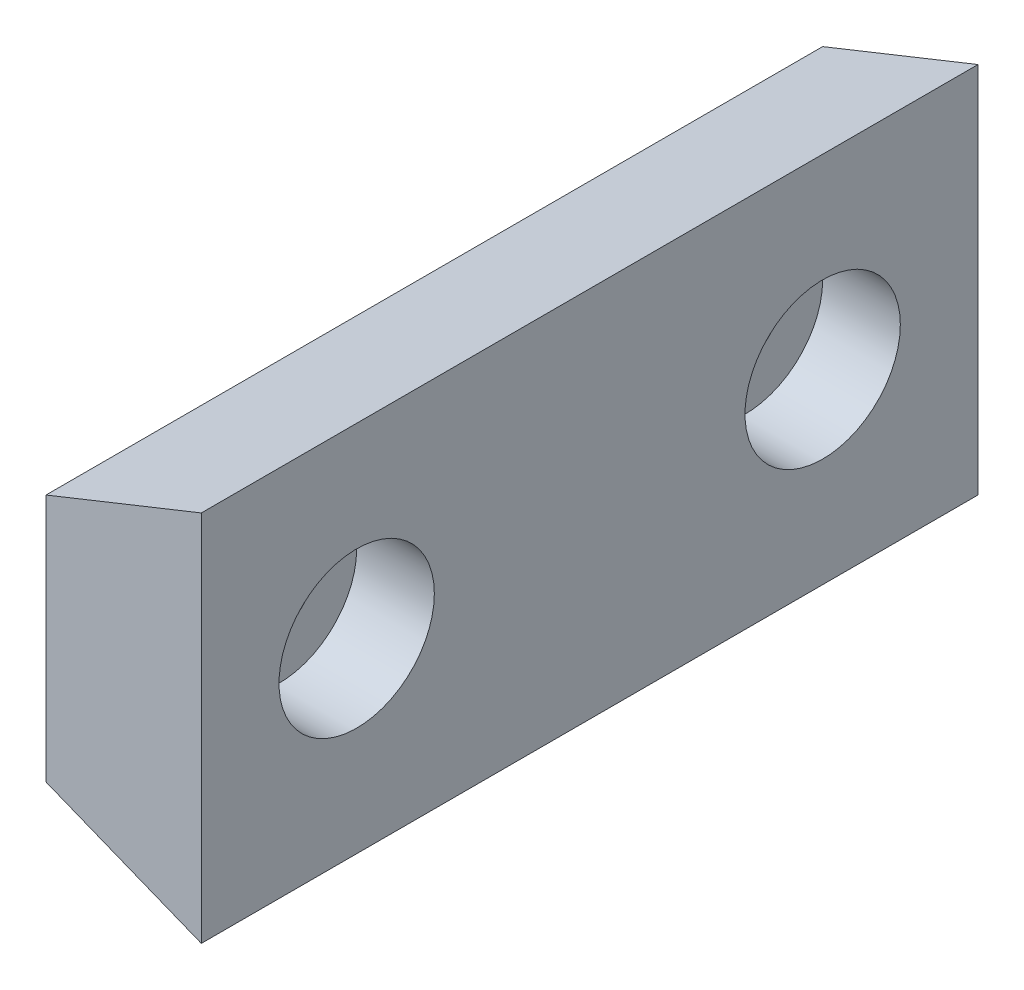
ISO-10303-21;
HEADER;
FILE_DESCRIPTION(('STEP AP214'),'2;1');
FILE_NAME('part.step','',(''),(''),'','','');
FILE_SCHEMA(('AUTOMOTIVE_DESIGN { 1 0 10303 214 1 1 1 1 }'));
ENDSEC;
DATA;
#1=APPLICATION_CONTEXT('core data for automotive mechanical design processes');
#2=APPLICATION_PROTOCOL_DEFINITION('international standard','automotive_design',2000,#1);
#3=PRODUCT_CONTEXT('',#1,'mechanical');
#4=PRODUCT('Part','Part','',(#3));
#5=PRODUCT_RELATED_PRODUCT_CATEGORY('part','',(#4));
#6=PRODUCT_DEFINITION_FORMATION('','',#4);
#7=PRODUCT_DEFINITION_CONTEXT('part definition',#1,'design');
#8=PRODUCT_DEFINITION('design','',#6,#7);
#9=PRODUCT_DEFINITION_SHAPE('','',#8);
#10=(LENGTH_UNIT() NAMED_UNIT(*) SI_UNIT(.MILLI.,.METRE.));
#11=(NAMED_UNIT(*) PLANE_ANGLE_UNIT() SI_UNIT($,.RADIAN.));
#12=(NAMED_UNIT(*) SI_UNIT($,.STERADIAN.) SOLID_ANGLE_UNIT());
#13=UNCERTAINTY_MEASURE_WITH_UNIT(LENGTH_MEASURE(1.E-05),#10,'distance_accuracy_value','');
#14=(GEOMETRIC_REPRESENTATION_CONTEXT(3) GLOBAL_UNCERTAINTY_ASSIGNED_CONTEXT((#13)) GLOBAL_UNIT_ASSIGNED_CONTEXT((#10,
#11,#12)) REPRESENTATION_CONTEXT('',''));
#15=CARTESIAN_POINT('',(0.,0.,0.));
#16=DIRECTION('',(0.,0.,1.));
#17=DIRECTION('',(1.,0.,0.));
#18=AXIS2_PLACEMENT_3D('',#15,#16,#17);
#19=CARTESIAN_POINT('',(-20.,0.,5.));
#20=DIRECTION('',(1.,0.,0.));
#21=DIRECTION('',(0.,0.,-1.));
#22=AXIS2_PLACEMENT_3D('',#19,#20,#21);
#23=CYLINDRICAL_SURFACE('',#22,1.05);
#24=CARTESIAN_POINT('',(-5.,0.,5.));
#25=DIRECTION('',(1.,0.,0.));
#26=DIRECTION('',(0.,0.,-1.));
#27=AXIS2_PLACEMENT_3D('',#24,#25,#26);
#28=CIRCLE('',#27,1.05);
#29=CARTESIAN_POINT('',(-5.,0.,3.95));
#30=VERTEX_POINT('',#29);
#31=EDGE_CURVE('E132',#30,#30,#28,.T.);
#32=ORIENTED_EDGE('',*,*,#31,.F.);
#33=EDGE_LOOP('',(#32));
#34=FACE_BOUND('',#33,.T.);
#35=CARTESIAN_POINT('',(-2.5,0.,5.));
#36=DIRECTION('',(1.,0.,0.));
#37=DIRECTION('',(0.,0.,-1.));
#38=AXIS2_PLACEMENT_3D('',#35,#36,#37);
#39=CIRCLE('',#38,1.05);
#40=CARTESIAN_POINT('',(-2.5,0.,3.95));
#41=VERTEX_POINT('',#40);
#42=EDGE_CURVE('E49',#41,#41,#39,.F.);
#43=ORIENTED_EDGE('',*,*,#42,.F.);
#44=EDGE_LOOP('',(#43));
#45=FACE_BOUND('',#44,.T.);
#46=ADVANCED_FACE('F45',(#34,#45),#23,.F.);
#47=CARTESIAN_POINT('',(-20.,0.,20.));
#48=DIRECTION('',(1.,0.,0.));
#49=DIRECTION('',(0.,0.,-1.));
#50=AXIS2_PLACEMENT_3D('',#47,#48,#49);
#51=CYLINDRICAL_SURFACE('',#50,1.05);
#52=CARTESIAN_POINT('',(-5.,0.,20.));
#53=DIRECTION('',(1.,0.,0.));
#54=DIRECTION('',(0.,0.,-1.));
#55=AXIS2_PLACEMENT_3D('',#52,#53,#54);
#56=CIRCLE('',#55,1.05);
#57=CARTESIAN_POINT('',(-5.,0.,18.95));
#58=VERTEX_POINT('',#57);
#59=EDGE_CURVE('E121',#58,#58,#56,.T.);
#60=ORIENTED_EDGE('',*,*,#59,.F.);
#61=EDGE_LOOP('',(#60));
#62=FACE_BOUND('',#61,.T.);
#63=CARTESIAN_POINT('',(-2.5,0.,20.));
#64=DIRECTION('',(1.,0.,0.));
#65=DIRECTION('',(0.,0.,-1.));
#66=AXIS2_PLACEMENT_3D('',#63,#64,#65);
#67=CIRCLE('',#66,1.05);
#68=CARTESIAN_POINT('',(-2.5,0.,18.95));
#69=VERTEX_POINT('',#68);
#70=EDGE_CURVE('E138',#69,#69,#67,.F.);
#71=ORIENTED_EDGE('',*,*,#70,.F.);
#72=EDGE_LOOP('',(#71));
#73=FACE_BOUND('',#72,.T.);
#74=ADVANCED_FACE('F185',(#62,#73),#51,.F.);
#75=CARTESIAN_POINT('',(-5.,-4.,25.));
#76=DIRECTION('',(0.371390676354104,0.928476690885259,0.));
#77=DIRECTION('',(-0.928476690885259,0.371390676354104,0.));
#78=AXIS2_PLACEMENT_3D('',#75,#76,#77);
#79=PLANE('',#78);
#80=DIRECTION('',(0.928476690885259,-0.371390676354104,0.));
#81=VECTOR('',#80,1.);
#82=CARTESIAN_POINT('',(-5.,-4.,0.));
#83=LINE('',#82,#81);
#84=CARTESIAN_POINT('',(-5.,-4.,0.));
#85=VERTEX_POINT('',#84);
#86=CARTESIAN_POINT('',(0.,-6.,0.));
#87=VERTEX_POINT('',#86);
#88=EDGE_CURVE('E117',#85,#87,#83,.T.);
#89=ORIENTED_EDGE('',*,*,#88,.T.);
#90=DIRECTION('',(0.,0.,-1.));
#91=VECTOR('',#90,1.);
#92=CARTESIAN_POINT('',(0.,-6.,25.));
#93=LINE('',#92,#91);
#94=CARTESIAN_POINT('',(0.,-6.,25.));
#95=VERTEX_POINT('',#94);
#96=EDGE_CURVE('E11',#95,#87,#93,.T.);
#97=ORIENTED_EDGE('',*,*,#96,.F.);
#98=DIRECTION('',(0.928476690885259,-0.371390676354104,0.));
#99=VECTOR('',#98,1.);
#100=CARTESIAN_POINT('',(-5.,-4.,25.));
#101=LINE('',#100,#99);
#102=CARTESIAN_POINT('',(-5.,-4.,25.));
#103=VERTEX_POINT('',#102);
#104=EDGE_CURVE('E100',#103,#95,#101,.T.);
#105=ORIENTED_EDGE('',*,*,#104,.F.);
#106=DIRECTION('',(0.,0.,-1.));
#107=VECTOR('',#106,1.);
#108=CARTESIAN_POINT('',(-5.,-4.,25.));
#109=LINE('',#108,#107);
#110=EDGE_CURVE('E113',#103,#85,#109,.T.);
#111=ORIENTED_EDGE('',*,*,#110,.T.);
#112=EDGE_LOOP('',(#89,#97,#105,#111));
#113=FACE_BOUND('',#112,.T.);
#114=ADVANCED_FACE('F47',(#113),#79,.F.);
#115=CARTESIAN_POINT('',(0.,-6.,25.));
#116=DIRECTION('',(-1.,0.,0.));
#117=DIRECTION('',(0.,0.,1.));
#118=AXIS2_PLACEMENT_3D('',#115,#116,#117);
#119=PLANE('',#118);
#120=CARTESIAN_POINT('',(0.,0.,20.));
#121=DIRECTION('',(1.,0.,0.));
#122=DIRECTION('',(0.,0.,-1.));
#123=AXIS2_PLACEMENT_3D('',#120,#121,#122);
#124=CIRCLE('',#123,2.5);
#125=CARTESIAN_POINT('',(0.,0.,17.5));
#126=VERTEX_POINT('',#125);
#127=EDGE_CURVE('E148',#126,#126,#124,.T.);
#128=ORIENTED_EDGE('',*,*,#127,.F.);
#129=EDGE_LOOP('',(#128));
#130=FACE_BOUND('',#129,.T.);
#131=CARTESIAN_POINT('',(0.,0.,5.));
#132=DIRECTION('',(1.,0.,0.));
#133=DIRECTION('',(0.,0.,-1.));
#134=AXIS2_PLACEMENT_3D('',#131,#132,#133);
#135=CIRCLE('',#134,2.5);
#136=CARTESIAN_POINT('',(0.,0.,2.5));
#137=VERTEX_POINT('',#136);
#138=EDGE_CURVE('E154',#137,#137,#135,.T.);
#139=ORIENTED_EDGE('',*,*,#138,.F.);
#140=EDGE_LOOP('',(#139));
#141=FACE_BOUND('',#140,.T.);
#142=DIRECTION('',(0.,1.,0.));
#143=VECTOR('',#142,1.);
#144=CARTESIAN_POINT('',(0.,-6.,0.));
#145=LINE('',#144,#143);
#146=CARTESIAN_POINT('',(0.,6.,0.));
#147=VERTEX_POINT('',#146);
#148=EDGE_CURVE('E105',#87,#147,#145,.T.);
#149=ORIENTED_EDGE('',*,*,#148,.T.);
#150=DIRECTION('',(0.,0.,-1.));
#151=VECTOR('',#150,1.);
#152=CARTESIAN_POINT('',(0.,6.,25.));
#153=LINE('',#152,#151);
#154=CARTESIAN_POINT('',(0.,6.,25.));
#155=VERTEX_POINT('',#154);
#156=EDGE_CURVE('E56',#155,#147,#153,.T.);
#157=ORIENTED_EDGE('',*,*,#156,.F.);
#158=DIRECTION('',(0.,1.,0.));
#159=VECTOR('',#158,1.);
#160=CARTESIAN_POINT('',(0.,-6.,25.));
#161=LINE('',#160,#159);
#162=EDGE_CURVE('E95',#95,#155,#161,.T.);
#163=ORIENTED_EDGE('',*,*,#162,.F.);
#164=ORIENTED_EDGE('',*,*,#96,.T.);
#165=EDGE_LOOP('',(#149,#157,#163,#164));
#166=FACE_BOUND('',#165,.T.);
#167=ADVANCED_FACE('F104',(#130,#141,#166),#119,.F.);
#168=CARTESIAN_POINT('',(0.,6.,25.));
#169=DIRECTION('',(0.371390676354104,-0.928476690885259,0.));
#170=DIRECTION('',(0.928476690885259,0.371390676354104,0.));
#171=AXIS2_PLACEMENT_3D('',#168,#169,#170);
#172=PLANE('',#171);
#173=DIRECTION('',(-0.928476690885259,-0.371390676354104,0.));
#174=VECTOR('',#173,1.);
#175=CARTESIAN_POINT('',(0.,6.,0.));
#176=LINE('',#175,#174);
#177=CARTESIAN_POINT('',(-5.,4.,0.));
#178=VERTEX_POINT('',#177);
#179=EDGE_CURVE('E82',#147,#178,#176,.T.);
#180=ORIENTED_EDGE('',*,*,#179,.T.);
#181=DIRECTION('',(0.,0.,-1.));
#182=VECTOR('',#181,1.);
#183=CARTESIAN_POINT('',(-5.,4.,25.));
#184=LINE('',#183,#182);
#185=CARTESIAN_POINT('',(-5.,4.,25.));
#186=VERTEX_POINT('',#185);
#187=EDGE_CURVE('E107',#186,#178,#184,.T.);
#188=ORIENTED_EDGE('',*,*,#187,.F.);
#189=DIRECTION('',(-0.928476690885259,-0.371390676354104,0.));
#190=VECTOR('',#189,1.);
#191=CARTESIAN_POINT('',(0.,6.,25.));
#192=LINE('',#191,#190);
#193=EDGE_CURVE('E98',#155,#186,#192,.T.);
#194=ORIENTED_EDGE('',*,*,#193,.F.);
#195=ORIENTED_EDGE('',*,*,#156,.T.);
#196=EDGE_LOOP('',(#180,#188,#194,#195));
#197=FACE_BOUND('',#196,.T.);
#198=ADVANCED_FACE('F109',(#197),#172,.F.);
#199=CARTESIAN_POINT('',(-5.,4.,25.));
#200=DIRECTION('',(1.,0.,0.));
#201=DIRECTION('',(0.,0.,-1.));
#202=AXIS2_PLACEMENT_3D('',#199,#200,#201);
#203=PLANE('',#202);
#204=ORIENTED_EDGE('',*,*,#59,.T.);
#205=EDGE_LOOP('',(#204));
#206=FACE_BOUND('',#205,.T.);
#207=ORIENTED_EDGE('',*,*,#31,.T.);
#208=EDGE_LOOP('',(#207));
#209=FACE_BOUND('',#208,.T.);
#210=DIRECTION('',(0.,-1.,0.));
#211=VECTOR('',#210,1.);
#212=CARTESIAN_POINT('',(-5.,4.,0.));
#213=LINE('',#212,#211);
#214=EDGE_CURVE('E88',#178,#85,#213,.T.);
#215=ORIENTED_EDGE('',*,*,#214,.T.);
#216=ORIENTED_EDGE('',*,*,#110,.F.);
#217=DIRECTION('',(0.,-1.,0.));
#218=VECTOR('',#217,1.);
#219=CARTESIAN_POINT('',(-5.,4.,25.));
#220=LINE('',#219,#218);
#221=EDGE_CURVE('E65',#186,#103,#220,.T.);
#222=ORIENTED_EDGE('',*,*,#221,.F.);
#223=ORIENTED_EDGE('',*,*,#187,.T.);
#224=EDGE_LOOP('',(#215,#216,#222,#223));
#225=FACE_BOUND('',#224,.T.);
#226=ADVANCED_FACE('F182',(#206,#209,#225),#203,.F.);
#227=CARTESIAN_POINT('',(0.,0.,25.));
#228=DIRECTION('',(0.,0.,1.));
#229=DIRECTION('',(1.,0.,0.));
#230=AXIS2_PLACEMENT_3D('',#227,#228,#229);
#231=PLANE('',#230);
#232=ORIENTED_EDGE('',*,*,#104,.T.);
#233=ORIENTED_EDGE('',*,*,#162,.T.);
#234=ORIENTED_EDGE('',*,*,#193,.T.);
#235=ORIENTED_EDGE('',*,*,#221,.T.);
#236=EDGE_LOOP('',(#232,#233,#234,#235));
#237=FACE_BOUND('',#236,.T.);
#238=ADVANCED_FACE('F96',(#237),#231,.T.);
#239=CARTESIAN_POINT('',(0.,0.,0.));
#240=DIRECTION('',(0.,0.,1.));
#241=DIRECTION('',(1.,0.,0.));
#242=AXIS2_PLACEMENT_3D('',#239,#240,#241);
#243=PLANE('',#242);
#244=ORIENTED_EDGE('',*,*,#88,.F.);
#245=ORIENTED_EDGE('',*,*,#214,.F.);
#246=ORIENTED_EDGE('',*,*,#179,.F.);
#247=ORIENTED_EDGE('',*,*,#148,.F.);
#248=EDGE_LOOP('',(#244,#245,#246,#247));
#249=FACE_BOUND('',#248,.T.);
#250=ADVANCED_FACE('F202',(#249),#243,.F.);
#251=CARTESIAN_POINT('',(-2.5,0.,20.));
#252=DIRECTION('',(1.,0.,0.));
#253=DIRECTION('',(0.,0.,-1.));
#254=AXIS2_PLACEMENT_3D('',#251,#252,#253);
#255=PLANE('',#254);
#256=CARTESIAN_POINT('',(-2.5,0.,20.));
#257=DIRECTION('',(1.,0.,0.));
#258=DIRECTION('',(0.,0.,-1.));
#259=AXIS2_PLACEMENT_3D('',#256,#257,#258);
#260=CIRCLE('',#259,2.5);
#261=CARTESIAN_POINT('',(-2.5,0.,17.5));
#262=VERTEX_POINT('',#261);
#263=EDGE_CURVE('E141',#262,#262,#260,.T.);
#264=ORIENTED_EDGE('',*,*,#263,.T.);
#265=EDGE_LOOP('',(#264));
#266=FACE_BOUND('',#265,.T.);
#267=ORIENTED_EDGE('',*,*,#70,.T.);
#268=EDGE_LOOP('',(#267));
#269=FACE_BOUND('',#268,.T.);
#270=ADVANCED_FACE('F205',(#266,#269),#255,.T.);
#271=CARTESIAN_POINT('',(-2.5,0.,20.));
#272=DIRECTION('',(1.,0.,0.));
#273=DIRECTION('',(0.,0.,-1.));
#274=AXIS2_PLACEMENT_3D('',#271,#272,#273);
#275=CYLINDRICAL_SURFACE('',#274,2.5);
#276=ORIENTED_EDGE('',*,*,#263,.F.);
#277=EDGE_LOOP('',(#276));
#278=FACE_BOUND('',#277,.T.);
#279=ORIENTED_EDGE('',*,*,#127,.T.);
#280=EDGE_LOOP('',(#279));
#281=FACE_BOUND('',#280,.T.);
#282=ADVANCED_FACE('F259',(#278,#281),#275,.F.);
#283=CARTESIAN_POINT('',(-2.5,0.,5.));
#284=DIRECTION('',(1.,0.,0.));
#285=DIRECTION('',(0.,0.,-1.));
#286=AXIS2_PLACEMENT_3D('',#283,#284,#285);
#287=PLANE('',#286);
#288=CARTESIAN_POINT('',(-2.5,0.,5.));
#289=DIRECTION('',(1.,0.,0.));
#290=DIRECTION('',(0.,0.,-1.));
#291=AXIS2_PLACEMENT_3D('',#288,#289,#290);
#292=CIRCLE('',#291,2.5);
#293=CARTESIAN_POINT('',(-2.5,0.,2.5));
#294=VERTEX_POINT('',#293);
#295=EDGE_CURVE('E160',#294,#294,#292,.T.);
#296=ORIENTED_EDGE('',*,*,#295,.T.);
#297=EDGE_LOOP('',(#296));
#298=FACE_BOUND('',#297,.T.);
#299=ORIENTED_EDGE('',*,*,#42,.T.);
#300=EDGE_LOOP('',(#299));
#301=FACE_BOUND('',#300,.T.);
#302=ADVANCED_FACE('F166',(#298,#301),#287,.T.);
#303=CARTESIAN_POINT('',(-2.5,0.,5.));
#304=DIRECTION('',(1.,0.,0.));
#305=DIRECTION('',(0.,0.,-1.));
#306=AXIS2_PLACEMENT_3D('',#303,#304,#305);
#307=CYLINDRICAL_SURFACE('',#306,2.5);
#308=ORIENTED_EDGE('',*,*,#295,.F.);
#309=EDGE_LOOP('',(#308));
#310=FACE_BOUND('',#309,.T.);
#311=ORIENTED_EDGE('',*,*,#138,.T.);
#312=EDGE_LOOP('',(#311));
#313=FACE_BOUND('',#312,.T.);
#314=ADVANCED_FACE('F169',(#310,#313),#307,.F.);
#315=CLOSED_SHELL('',(#46,#74,#114,#167,#198,#226,#238,#250,#270,#282,#302,#314));
#316=MANIFOLD_SOLID_BREP('B2',#315);
#317=ADVANCED_BREP_SHAPE_REPRESENTATION('',(#18,#316),#14);
#318=SHAPE_DEFINITION_REPRESENTATION(#9,#317);
ENDSEC;
END-ISO-10303-21;
